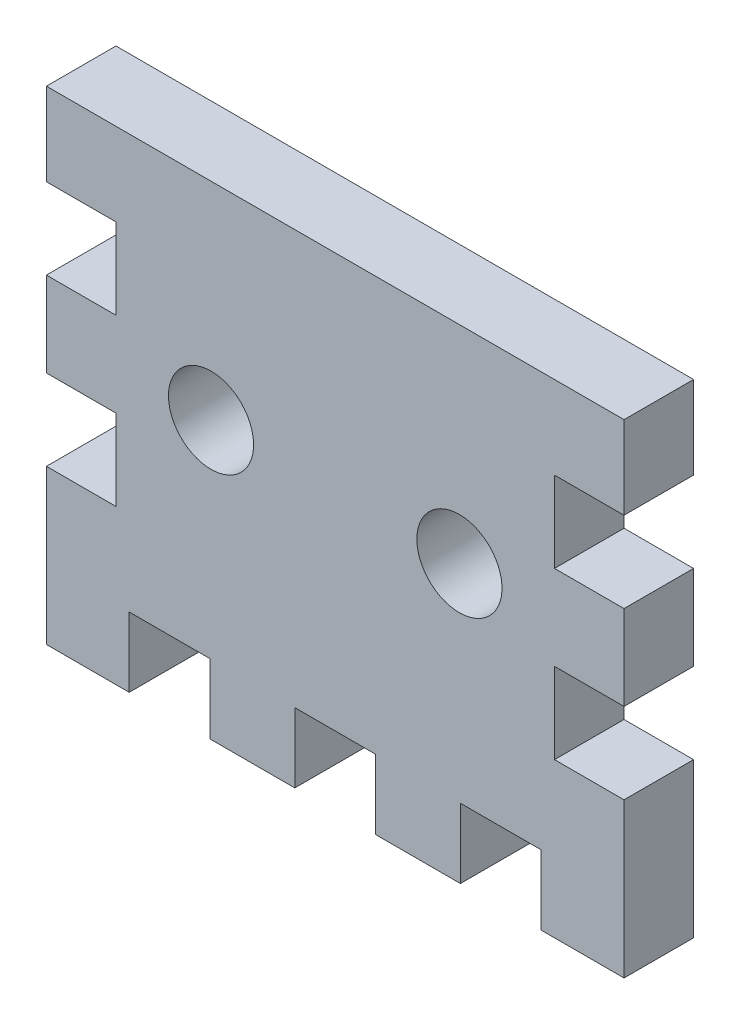
ISO-10303-21;
HEADER;
FILE_DESCRIPTION(('STEP AP214'),'2;1');
FILE_NAME('part.step','',(''),(''),'','','');
FILE_SCHEMA(('AUTOMOTIVE_DESIGN { 1 0 10303 214 1 1 1 1 }'));
ENDSEC;
DATA;
#1=APPLICATION_CONTEXT('core data for automotive mechanical design processes');
#2=APPLICATION_PROTOCOL_DEFINITION('international standard','automotive_design',2000,#1);
#3=PRODUCT_CONTEXT('',#1,'mechanical');
#4=PRODUCT('Part','Part','',(#3));
#5=PRODUCT_RELATED_PRODUCT_CATEGORY('part','',(#4));
#6=PRODUCT_DEFINITION_FORMATION('','',#4);
#7=PRODUCT_DEFINITION_CONTEXT('part definition',#1,'design');
#8=PRODUCT_DEFINITION('design','',#6,#7);
#9=PRODUCT_DEFINITION_SHAPE('','',#8);
#10=(LENGTH_UNIT() NAMED_UNIT(*) SI_UNIT(.MILLI.,.METRE.));
#11=(NAMED_UNIT(*) PLANE_ANGLE_UNIT() SI_UNIT($,.RADIAN.));
#12=(NAMED_UNIT(*) SI_UNIT($,.STERADIAN.) SOLID_ANGLE_UNIT());
#13=UNCERTAINTY_MEASURE_WITH_UNIT(LENGTH_MEASURE(1.E-05),#10,'distance_accuracy_value','');
#14=(GEOMETRIC_REPRESENTATION_CONTEXT(3) GLOBAL_UNCERTAINTY_ASSIGNED_CONTEXT((#13)) GLOBAL_UNIT_ASSIGNED_CONTEXT((#10,
#11,#12)) REPRESENTATION_CONTEXT('',''));
#15=CARTESIAN_POINT('',(0.,0.,0.));
#16=DIRECTION('',(0.,0.,1.));
#17=DIRECTION('',(1.,0.,0.));
#18=AXIS2_PLACEMENT_3D('',#15,#16,#17);
#19=CARTESIAN_POINT('',(27.94,-5.33400000000002,-5.334));
#20=DIRECTION('',(1.,0.,0.));
#21=DIRECTION('',(0.,0.,-1.));
#22=AXIS2_PLACEMENT_3D('',#19,#20,#21);
#23=PLANE('',#22);
#24=DIRECTION('',(0.,1.,0.));
#25=VECTOR('',#24,1.);
#26=CARTESIAN_POINT('',(27.94,-5.33400000000002,0.));
#27=LINE('',#26,#25);
#28=CARTESIAN_POINT('',(27.9400000000001,12.7,0.));
#29=VERTEX_POINT('',#28);
#30=CARTESIAN_POINT('',(27.9400000000001,19.2024,0.));
#31=VERTEX_POINT('',#30);
#32=EDGE_CURVE('E260',#29,#31,#27,.T.);
#33=ORIENTED_EDGE('',*,*,#32,.T.);
#34=DIRECTION('',(0.,0.,-1.));
#35=VECTOR('',#34,1.);
#36=CARTESIAN_POINT('',(27.9400000000001,19.2024,0.));
#37=LINE('',#36,#35);
#38=CARTESIAN_POINT('',(27.9400000000001,19.2024,-5.334));
#39=VERTEX_POINT('',#38);
#40=EDGE_CURVE('E244',#31,#39,#37,.T.);
#41=ORIENTED_EDGE('',*,*,#40,.T.);
#42=DIRECTION('',(0.,1.,0.));
#43=VECTOR('',#42,1.);
#44=CARTESIAN_POINT('',(27.94,-5.33400000000002,-5.334));
#45=LINE('',#44,#43);
#46=CARTESIAN_POINT('',(27.9400000000001,12.7,-5.334));
#47=VERTEX_POINT('',#46);
#48=EDGE_CURVE('E290',#47,#39,#45,.T.);
#49=ORIENTED_EDGE('',*,*,#48,.F.);
#50=DIRECTION('',(0.,0.,-1.));
#51=VECTOR('',#50,1.);
#52=CARTESIAN_POINT('',(27.9400000000001,12.7,0.));
#53=LINE('',#52,#51);
#54=EDGE_CURVE('E266',#29,#47,#53,.T.);
#55=ORIENTED_EDGE('',*,*,#54,.F.);
#56=EDGE_LOOP('',(#33,#41,#49,#55));
#57=FACE_BOUND('',#56,.T.);
#58=ADVANCED_FACE('F34',(#57),#23,.F.);
#59=CARTESIAN_POINT('',(72.2376,-5.334,-5.334));
#60=DIRECTION('',(1.,0.,0.));
#61=DIRECTION('',(0.,0.,-1.));
#62=AXIS2_PLACEMENT_3D('',#59,#60,#61);
#63=PLANE('',#62);
#64=DIRECTION('',(0.,0.,-1.));
#65=VECTOR('',#64,1.);
#66=CARTESIAN_POINT('',(72.2376,25.4,0.));
#67=LINE('',#66,#65);
#68=CARTESIAN_POINT('',(72.2376,25.4,0.));
#69=VERTEX_POINT('',#68);
#70=CARTESIAN_POINT('',(72.2376,25.4,-5.334));
#71=VERTEX_POINT('',#70);
#72=EDGE_CURVE('E441',#69,#71,#67,.T.);
#73=ORIENTED_EDGE('',*,*,#72,.T.);
#74=DIRECTION('',(0.,1.,0.));
#75=VECTOR('',#74,1.);
#76=CARTESIAN_POINT('',(72.2376,-5.334,-5.334));
#77=LINE('',#76,#75);
#78=CARTESIAN_POINT('',(72.2376,31.75,-5.334));
#79=VERTEX_POINT('',#78);
#80=EDGE_CURVE('E310',#71,#79,#77,.T.);
#81=ORIENTED_EDGE('',*,*,#80,.T.);
#82=DIRECTION('',(0.,0.,1.));
#83=VECTOR('',#82,1.);
#84=CARTESIAN_POINT('',(72.2376,31.75,-5.334));
#85=LINE('',#84,#83);
#86=CARTESIAN_POINT('',(72.2376,31.75,0.));
#87=VERTEX_POINT('',#86);
#88=EDGE_CURVE('E277',#79,#87,#85,.T.);
#89=ORIENTED_EDGE('',*,*,#88,.T.);
#90=DIRECTION('',(0.,1.,0.));
#91=VECTOR('',#90,1.);
#92=CARTESIAN_POINT('',(72.2376,-5.334,0.));
#93=LINE('',#92,#91);
#94=EDGE_CURVE('E524',#69,#87,#93,.T.);
#95=ORIENTED_EDGE('',*,*,#94,.F.);
#96=EDGE_LOOP('',(#73,#81,#89,#95));
#97=FACE_BOUND('',#96,.T.);
#98=ADVANCED_FACE('F575',(#97),#63,.T.);
#99=CARTESIAN_POINT('',(27.94,-5.33400000000002,0.));
#100=VERTEX_POINT('',#99);
#101=CARTESIAN_POINT('',(27.94,6.50239999999998,0.));
#102=VERTEX_POINT('',#101);
#103=EDGE_CURVE('E267',#100,#102,#27,.T.);
#104=ORIENTED_EDGE('',*,*,#103,.T.);
#105=DIRECTION('',(0.,0.,-1.));
#106=VECTOR('',#105,1.);
#107=CARTESIAN_POINT('',(27.94,6.50239999999998,0.));
#108=LINE('',#107,#106);
#109=CARTESIAN_POINT('',(27.94,6.50239999999998,-5.334));
#110=VERTEX_POINT('',#109);
#111=EDGE_CURVE('E424',#102,#110,#108,.T.);
#112=ORIENTED_EDGE('',*,*,#111,.T.);
#113=CARTESIAN_POINT('',(27.94,-5.33400000000002,-5.334));
#114=VERTEX_POINT('',#113);
#115=EDGE_CURVE('E284',#114,#110,#45,.T.);
#116=ORIENTED_EDGE('',*,*,#115,.F.);
#117=DIRECTION('',(0.,0.,1.));
#118=VECTOR('',#117,1.);
#119=CARTESIAN_POINT('',(27.94,-5.33400000000002,-5.334));
#120=LINE('',#119,#118);
#121=EDGE_CURVE('E11',#114,#100,#120,.T.);
#122=ORIENTED_EDGE('',*,*,#121,.T.);
#123=EDGE_LOOP('',(#104,#112,#116,#122));
#124=FACE_BOUND('',#123,.T.);
#125=ADVANCED_FACE('F518',(#124),#23,.F.);
#126=DIRECTION('',(0.,0.,-1.));
#127=VECTOR('',#126,1.);
#128=CARTESIAN_POINT('',(72.2376,19.2024,0.));
#129=LINE('',#128,#127);
#130=CARTESIAN_POINT('',(72.2376,19.2024,0.));
#131=VERTEX_POINT('',#130);
#132=CARTESIAN_POINT('',(72.2376,19.2024,-5.334));
#133=VERTEX_POINT('',#132);
#134=EDGE_CURVE('E448',#131,#133,#129,.T.);
#135=ORIENTED_EDGE('',*,*,#134,.F.);
#136=CARTESIAN_POINT('',(72.2376,12.7,0.));
#137=VERTEX_POINT('',#136);
#138=EDGE_CURVE('E526',#137,#131,#93,.T.);
#139=ORIENTED_EDGE('',*,*,#138,.F.);
#140=DIRECTION('',(0.,0.,-1.));
#141=VECTOR('',#140,1.);
#142=CARTESIAN_POINT('',(72.2376,12.7,0.));
#143=LINE('',#142,#141);
#144=CARTESIAN_POINT('',(72.2376,12.7,-5.334));
#145=VERTEX_POINT('',#144);
#146=EDGE_CURVE('E390',#137,#145,#143,.T.);
#147=ORIENTED_EDGE('',*,*,#146,.T.);
#148=EDGE_CURVE('E308',#145,#133,#77,.T.);
#149=ORIENTED_EDGE('',*,*,#148,.T.);
#150=EDGE_LOOP('',(#135,#139,#147,#149));
#151=FACE_BOUND('',#150,.T.);
#152=ADVANCED_FACE('F562',(#151),#63,.T.);
#153=CARTESIAN_POINT('',(27.94,-5.33400000000002,-5.334));
#154=DIRECTION('',(0.,-1.,0.));
#155=DIRECTION('',(0.,0.,-1.));
#156=AXIS2_PLACEMENT_3D('',#153,#154,#155);
#157=PLANE('',#156);
#158=DIRECTION('',(0.,0.,1.));
#159=VECTOR('',#158,1.);
#160=CARTESIAN_POINT('',(40.4876,-5.33399999999999,-5.334));
#161=LINE('',#160,#159);
#162=CARTESIAN_POINT('',(40.4876,-5.33399999999999,-5.334));
#163=VERTEX_POINT('',#162);
#164=CARTESIAN_POINT('',(40.4876,-5.33399999999999,0.));
#165=VERTEX_POINT('',#164);
#166=EDGE_CURVE('E364',#163,#165,#161,.T.);
#167=ORIENTED_EDGE('',*,*,#166,.F.);
#168=DIRECTION('',(1.,0.,0.));
#169=VECTOR('',#168,1.);
#170=CARTESIAN_POINT('',(27.94,-5.33400000000002,-5.334));
#171=LINE('',#170,#169);
#172=CARTESIAN_POINT('',(46.99,-5.33400000000002,-5.334));
#173=VERTEX_POINT('',#172);
#174=EDGE_CURVE('E315',#163,#173,#171,.T.);
#175=ORIENTED_EDGE('',*,*,#174,.T.);
#176=DIRECTION('',(0.,0.,1.));
#177=VECTOR('',#176,1.);
#178=CARTESIAN_POINT('',(46.99,-5.33400000000002,-5.334));
#179=LINE('',#178,#177);
#180=CARTESIAN_POINT('',(46.99,-5.33400000000002,0.));
#181=VERTEX_POINT('',#180);
#182=EDGE_CURVE('E351',#173,#181,#179,.T.);
#183=ORIENTED_EDGE('',*,*,#182,.T.);
#184=DIRECTION('',(1.,0.,0.));
#185=VECTOR('',#184,1.);
#186=CARTESIAN_POINT('',(27.94,-5.33400000000002,0.));
#187=LINE('',#186,#185);
#188=EDGE_CURVE('E525',#165,#181,#187,.T.);
#189=ORIENTED_EDGE('',*,*,#188,.F.);
#190=EDGE_LOOP('',(#167,#175,#183,#189));
#191=FACE_BOUND('',#190,.T.);
#192=ADVANCED_FACE('F585',(#191),#157,.T.);
#193=DIRECTION('',(0.,0.,1.));
#194=VECTOR('',#193,1.);
#195=CARTESIAN_POINT('',(53.1876,-5.334,-5.334));
#196=LINE('',#195,#194);
#197=CARTESIAN_POINT('',(53.1876,-5.334,-5.334));
#198=VERTEX_POINT('',#197);
#199=CARTESIAN_POINT('',(53.1876,-5.334,0.));
#200=VERTEX_POINT('',#199);
#201=EDGE_CURVE('E337',#198,#200,#196,.T.);
#202=ORIENTED_EDGE('',*,*,#201,.F.);
#203=CARTESIAN_POINT('',(59.69,-5.334,-5.334));
#204=VERTEX_POINT('',#203);
#205=EDGE_CURVE('E544',#198,#204,#171,.T.);
#206=ORIENTED_EDGE('',*,*,#205,.T.);
#207=DIRECTION('',(0.,0.,1.));
#208=VECTOR('',#207,1.);
#209=CARTESIAN_POINT('',(59.69,-5.334,-5.334));
#210=LINE('',#209,#208);
#211=CARTESIAN_POINT('',(59.69,-5.334,0.));
#212=VERTEX_POINT('',#211);
#213=EDGE_CURVE('E322',#204,#212,#210,.T.);
#214=ORIENTED_EDGE('',*,*,#213,.T.);
#215=EDGE_CURVE('E528',#200,#212,#187,.T.);
#216=ORIENTED_EDGE('',*,*,#215,.F.);
#217=EDGE_LOOP('',(#202,#206,#214,#216));
#218=FACE_BOUND('',#217,.T.);
#219=ADVANCED_FACE('F542',(#218),#157,.T.);
#220=DIRECTION('',(0.,0.,1.));
#221=VECTOR('',#220,1.);
#222=CARTESIAN_POINT('',(65.8876,-5.33400000000002,-5.334));
#223=LINE('',#222,#221);
#224=CARTESIAN_POINT('',(65.8876,-5.33400000000002,-5.334));
#225=VERTEX_POINT('',#224);
#226=CARTESIAN_POINT('',(65.8876,-5.33400000000002,0.));
#227=VERTEX_POINT('',#226);
#228=EDGE_CURVE('E325',#225,#227,#223,.T.);
#229=ORIENTED_EDGE('',*,*,#228,.F.);
#230=CARTESIAN_POINT('',(72.2376,-5.334,-5.334));
#231=VERTEX_POINT('',#230);
#232=EDGE_CURVE('E271',#225,#231,#171,.T.);
#233=ORIENTED_EDGE('',*,*,#232,.T.);
#234=DIRECTION('',(0.,0.,1.));
#235=VECTOR('',#234,1.);
#236=CARTESIAN_POINT('',(72.2376,-5.334,-5.334));
#237=LINE('',#236,#235);
#238=CARTESIAN_POINT('',(72.2376,-5.334,0.));
#239=VERTEX_POINT('',#238);
#240=EDGE_CURVE('E38',#231,#239,#237,.T.);
#241=ORIENTED_EDGE('',*,*,#240,.T.);
#242=EDGE_CURVE('E327',#227,#239,#187,.T.);
#243=ORIENTED_EDGE('',*,*,#242,.F.);
#244=EDGE_LOOP('',(#229,#233,#241,#243));
#245=FACE_BOUND('',#244,.T.);
#246=ADVANCED_FACE('F547',(#245),#157,.T.);
#247=DIRECTION('',(0.,0.,1.));
#248=VECTOR('',#247,1.);
#249=CARTESIAN_POINT('',(34.29,-5.334,-5.334));
#250=LINE('',#249,#248);
#251=CARTESIAN_POINT('',(34.29,-5.334,-5.334));
#252=VERTEX_POINT('',#251);
#253=CARTESIAN_POINT('',(34.29,-5.334,0.));
#254=VERTEX_POINT('',#253);
#255=EDGE_CURVE('E378',#252,#254,#250,.T.);
#256=ORIENTED_EDGE('',*,*,#255,.T.);
#257=EDGE_CURVE('E522',#100,#254,#187,.T.);
#258=ORIENTED_EDGE('',*,*,#257,.F.);
#259=ORIENTED_EDGE('',*,*,#121,.F.);
#260=EDGE_CURVE('E312',#114,#252,#171,.T.);
#261=ORIENTED_EDGE('',*,*,#260,.T.);
#262=EDGE_LOOP('',(#256,#258,#259,#261));
#263=FACE_BOUND('',#262,.T.);
#264=ADVANCED_FACE('F36',(#263),#157,.T.);
#265=CARTESIAN_POINT('',(27.94,25.4,-5.334));
#266=VERTEX_POINT('',#265);
#267=CARTESIAN_POINT('',(27.94,31.75,-5.334));
#268=VERTEX_POINT('',#267);
#269=EDGE_CURVE('E292',#266,#268,#45,.T.);
#270=ORIENTED_EDGE('',*,*,#269,.F.);
#271=DIRECTION('',(0.,0.,-1.));
#272=VECTOR('',#271,1.);
#273=CARTESIAN_POINT('',(27.94,25.4,0.));
#274=LINE('',#273,#272);
#275=CARTESIAN_POINT('',(27.94,25.4,0.));
#276=VERTEX_POINT('',#275);
#277=EDGE_CURVE('E254',#276,#266,#274,.T.);
#278=ORIENTED_EDGE('',*,*,#277,.F.);
#279=CARTESIAN_POINT('',(27.94,31.75,0.));
#280=VERTEX_POINT('',#279);
#281=EDGE_CURVE('E268',#276,#280,#27,.T.);
#282=ORIENTED_EDGE('',*,*,#281,.T.);
#283=DIRECTION('',(0.,0.,1.));
#284=VECTOR('',#283,1.);
#285=CARTESIAN_POINT('',(27.94,31.75,-5.334));
#286=LINE('',#285,#284);
#287=EDGE_CURVE('E43',#268,#280,#286,.T.);
#288=ORIENTED_EDGE('',*,*,#287,.F.);
#289=EDGE_LOOP('',(#270,#278,#282,#288));
#290=FACE_BOUND('',#289,.T.);
#291=ADVANCED_FACE('F582',(#290),#23,.F.);
#292=CARTESIAN_POINT('',(27.94,31.75,-5.334));
#293=DIRECTION('',(0.,-1.,0.));
#294=DIRECTION('',(0.,0.,-1.));
#295=AXIS2_PLACEMENT_3D('',#292,#293,#294);
#296=PLANE('',#295);
#297=DIRECTION('',(1.,0.,0.));
#298=VECTOR('',#297,1.);
#299=CARTESIAN_POINT('',(27.94,31.75,0.));
#300=LINE('',#299,#298);
#301=EDGE_CURVE('E272',#280,#87,#300,.T.);
#302=ORIENTED_EDGE('',*,*,#301,.T.);
#303=ORIENTED_EDGE('',*,*,#88,.F.);
#304=DIRECTION('',(1.,0.,0.));
#305=VECTOR('',#304,1.);
#306=CARTESIAN_POINT('',(27.94,31.75,-5.334));
#307=LINE('',#306,#305);
#308=EDGE_CURVE('E299',#268,#79,#307,.T.);
#309=ORIENTED_EDGE('',*,*,#308,.F.);
#310=ORIENTED_EDGE('',*,*,#287,.T.);
#311=EDGE_LOOP('',(#302,#303,#309,#310));
#312=FACE_BOUND('',#311,.T.);
#313=ADVANCED_FACE('F587',(#312),#296,.F.);
#314=DIRECTION('',(0.,0.,-1.));
#315=VECTOR('',#314,1.);
#316=CARTESIAN_POINT('',(72.2376,6.50239999999999,0.));
#317=LINE('',#316,#315);
#318=CARTESIAN_POINT('',(72.2376,6.50239999999999,0.));
#319=VERTEX_POINT('',#318);
#320=CARTESIAN_POINT('',(72.2376,6.50239999999999,-5.334));
#321=VERTEX_POINT('',#320);
#322=EDGE_CURVE('E398',#319,#321,#317,.T.);
#323=ORIENTED_EDGE('',*,*,#322,.F.);
#324=EDGE_CURVE('E527',#239,#319,#93,.T.);
#325=ORIENTED_EDGE('',*,*,#324,.F.);
#326=ORIENTED_EDGE('',*,*,#240,.F.);
#327=EDGE_CURVE('E304',#231,#321,#77,.T.);
#328=ORIENTED_EDGE('',*,*,#327,.T.);
#329=EDGE_LOOP('',(#323,#325,#326,#328));
#330=FACE_BOUND('',#329,.T.);
#331=ADVANCED_FACE('F502',(#330),#63,.T.);
#332=CARTESIAN_POINT('',(0.,0.,-5.334));
#333=DIRECTION('',(0.,0.,1.));
#334=DIRECTION('',(1.,0.,0.));
#335=AXIS2_PLACEMENT_3D('',#332,#333,#334);
#336=PLANE('',#335);
#337=CARTESIAN_POINT('',(59.6138,15.875,-5.334));
#338=DIRECTION('',(0.,0.,-1.));
#339=DIRECTION('',(-1.,0.,0.));
#340=AXIS2_PLACEMENT_3D('',#337,#338,#339);
#341=CIRCLE('',#340,3.26389999999999);
#342=CARTESIAN_POINT('',(56.3499,15.875,-5.334));
#343=VERTEX_POINT('',#342);
#344=EDGE_CURVE('E493',#343,#343,#341,.T.);
#345=ORIENTED_EDGE('',*,*,#344,.F.);
#346=EDGE_LOOP('',(#345));
#347=FACE_BOUND('',#346,.T.);
#348=CARTESIAN_POINT('',(40.5638,15.875,-5.334));
#349=DIRECTION('',(0.,0.,-1.));
#350=DIRECTION('',(-1.,0.,0.));
#351=AXIS2_PLACEMENT_3D('',#348,#349,#350);
#352=CIRCLE('',#351,3.26389999999999);
#353=CARTESIAN_POINT('',(37.2999,15.875,-5.334));
#354=VERTEX_POINT('',#353);
#355=EDGE_CURVE('E487',#354,#354,#352,.T.);
#356=ORIENTED_EDGE('',*,*,#355,.F.);
#357=EDGE_LOOP('',(#356));
#358=FACE_BOUND('',#357,.T.);
#359=ORIENTED_EDGE('',*,*,#48,.T.);
#360=DIRECTION('',(-1.,0.,0.));
#361=VECTOR('',#360,1.);
#362=CARTESIAN_POINT('',(27.9400000000001,19.2024,-5.334));
#363=LINE('',#362,#361);
#364=CARTESIAN_POINT('',(33.2740000000001,19.2024,-5.334));
#365=VERTEX_POINT('',#364);
#366=EDGE_CURVE('E249',#365,#39,#363,.T.);
#367=ORIENTED_EDGE('',*,*,#366,.F.);
#368=DIRECTION('',(0.,-1.,0.));
#369=VECTOR('',#368,1.);
#370=CARTESIAN_POINT('',(33.2740000000001,19.2024,-5.334));
#371=LINE('',#370,#369);
#372=CARTESIAN_POINT('',(33.2740000000001,25.4,-5.334));
#373=VERTEX_POINT('',#372);
#374=EDGE_CURVE('E263',#373,#365,#371,.T.);
#375=ORIENTED_EDGE('',*,*,#374,.F.);
#376=DIRECTION('',(1.,0.,0.));
#377=VECTOR('',#376,1.);
#378=CARTESIAN_POINT('',(27.94,25.4,-5.334));
#379=LINE('',#378,#377);
#380=EDGE_CURVE('E478',#266,#373,#379,.T.);
#381=ORIENTED_EDGE('',*,*,#380,.F.);
#382=ORIENTED_EDGE('',*,*,#269,.T.);
#383=ORIENTED_EDGE('',*,*,#308,.T.);
#384=ORIENTED_EDGE('',*,*,#80,.F.);
#385=DIRECTION('',(1.,0.,0.));
#386=VECTOR('',#385,1.);
#387=CARTESIAN_POINT('',(72.2376,25.4,-5.334));
#388=LINE('',#387,#386);
#389=CARTESIAN_POINT('',(66.9036,25.4,-5.334));
#390=VERTEX_POINT('',#389);
#391=EDGE_CURVE('E457',#390,#71,#388,.T.);
#392=ORIENTED_EDGE('',*,*,#391,.F.);
#393=DIRECTION('',(0.,1.,0.));
#394=VECTOR('',#393,1.);
#395=CARTESIAN_POINT('',(66.9036,19.2024,-5.334));
#396=LINE('',#395,#394);
#397=CARTESIAN_POINT('',(66.9036,19.2024,-5.334));
#398=VERTEX_POINT('',#397);
#399=EDGE_CURVE('E460',#398,#390,#396,.T.);
#400=ORIENTED_EDGE('',*,*,#399,.F.);
#401=DIRECTION('',(-1.,0.,0.));
#402=VECTOR('',#401,1.);
#403=CARTESIAN_POINT('',(72.2376,19.2024,-5.334));
#404=LINE('',#403,#402);
#405=EDGE_CURVE('E463',#133,#398,#404,.T.);
#406=ORIENTED_EDGE('',*,*,#405,.F.);
#407=ORIENTED_EDGE('',*,*,#148,.F.);
#408=DIRECTION('',(1.,0.,0.));
#409=VECTOR('',#408,1.);
#410=CARTESIAN_POINT('',(72.2376,12.7,-5.334));
#411=LINE('',#410,#409);
#412=CARTESIAN_POINT('',(66.9036,12.7,-5.334));
#413=VERTEX_POINT('',#412);
#414=EDGE_CURVE('E407',#413,#145,#411,.T.);
#415=ORIENTED_EDGE('',*,*,#414,.F.);
#416=DIRECTION('',(0.,1.,0.));
#417=VECTOR('',#416,1.);
#418=CARTESIAN_POINT('',(66.9036,6.50240000000001,-5.334));
#419=LINE('',#418,#417);
#420=CARTESIAN_POINT('',(66.9036,6.50240000000001,-5.334));
#421=VERTEX_POINT('',#420);
#422=EDGE_CURVE('E410',#421,#413,#419,.T.);
#423=ORIENTED_EDGE('',*,*,#422,.F.);
#424=DIRECTION('',(-1.,0.,0.));
#425=VECTOR('',#424,1.);
#426=CARTESIAN_POINT('',(72.2376,6.50239999999999,-5.334));
#427=LINE('',#426,#425);
#428=EDGE_CURVE('E413',#321,#421,#427,.T.);
#429=ORIENTED_EDGE('',*,*,#428,.F.);
#430=ORIENTED_EDGE('',*,*,#327,.F.);
#431=ORIENTED_EDGE('',*,*,#232,.F.);
#432=DIRECTION('',(0.,1.,0.));
#433=VECTOR('',#432,1.);
#434=CARTESIAN_POINT('',(65.8876,-5.33400000000002,-5.334));
#435=LINE('',#434,#433);
#436=CARTESIAN_POINT('',(65.8876,0.,-5.334));
#437=VERTEX_POINT('',#436);
#438=EDGE_CURVE('E331',#225,#437,#435,.T.);
#439=ORIENTED_EDGE('',*,*,#438,.T.);
#440=DIRECTION('',(-1.,0.,0.));
#441=VECTOR('',#440,1.);
#442=CARTESIAN_POINT('',(65.8876,0.,-5.334));
#443=LINE('',#442,#441);
#444=CARTESIAN_POINT('',(59.69,0.,-5.334));
#445=VERTEX_POINT('',#444);
#446=EDGE_CURVE('E340',#437,#445,#443,.T.);
#447=ORIENTED_EDGE('',*,*,#446,.T.);
#448=DIRECTION('',(0.,-1.,0.));
#449=VECTOR('',#448,1.);
#450=CARTESIAN_POINT('',(59.69,-5.334,-5.334));
#451=LINE('',#450,#449);
#452=EDGE_CURVE('E320',#445,#204,#451,.T.);
#453=ORIENTED_EDGE('',*,*,#452,.T.);
#454=ORIENTED_EDGE('',*,*,#205,.F.);
#455=DIRECTION('',(0.,1.,0.));
#456=VECTOR('',#455,1.);
#457=CARTESIAN_POINT('',(53.1876,-5.334,-5.334));
#458=LINE('',#457,#456);
#459=CARTESIAN_POINT('',(53.1876,0.,-5.334));
#460=VERTEX_POINT('',#459);
#461=EDGE_CURVE('E358',#198,#460,#458,.T.);
#462=ORIENTED_EDGE('',*,*,#461,.T.);
#463=DIRECTION('',(-1.,0.,0.));
#464=VECTOR('',#463,1.);
#465=CARTESIAN_POINT('',(53.1876,0.,-5.334));
#466=LINE('',#465,#464);
#467=CARTESIAN_POINT('',(46.99,0.,-5.334));
#468=VERTEX_POINT('',#467);
#469=EDGE_CURVE('E367',#460,#468,#466,.T.);
#470=ORIENTED_EDGE('',*,*,#469,.T.);
#471=DIRECTION('',(0.,-1.,0.));
#472=VECTOR('',#471,1.);
#473=CARTESIAN_POINT('',(46.99,-5.33400000000002,-5.334));
#474=LINE('',#473,#472);
#475=EDGE_CURVE('E349',#468,#173,#474,.T.);
#476=ORIENTED_EDGE('',*,*,#475,.T.);
#477=ORIENTED_EDGE('',*,*,#174,.F.);
#478=DIRECTION('',(0.,1.,0.));
#479=VECTOR('',#478,1.);
#480=CARTESIAN_POINT('',(40.4876,-5.33399999999999,-5.334));
#481=LINE('',#480,#479);
#482=CARTESIAN_POINT('',(40.4876000000001,0.,-5.334));
#483=VERTEX_POINT('',#482);
#484=EDGE_CURVE('E384',#163,#483,#481,.T.);
#485=ORIENTED_EDGE('',*,*,#484,.T.);
#486=DIRECTION('',(-1.,0.,0.));
#487=VECTOR('',#486,1.);
#488=CARTESIAN_POINT('',(40.4876000000001,0.,-5.334));
#489=LINE('',#488,#487);
#490=CARTESIAN_POINT('',(34.29,0.,-5.334));
#491=VERTEX_POINT('',#490);
#492=EDGE_CURVE('E393',#483,#491,#489,.T.);
#493=ORIENTED_EDGE('',*,*,#492,.T.);
#494=DIRECTION('',(0.,-1.,0.));
#495=VECTOR('',#494,1.);
#496=CARTESIAN_POINT('',(34.29,-5.334,-5.334));
#497=LINE('',#496,#495);
#498=EDGE_CURVE('E376',#491,#252,#497,.T.);
#499=ORIENTED_EDGE('',*,*,#498,.T.);
#500=ORIENTED_EDGE('',*,*,#260,.F.);
#501=ORIENTED_EDGE('',*,*,#115,.T.);
#502=DIRECTION('',(-1.,0.,0.));
#503=VECTOR('',#502,1.);
#504=CARTESIAN_POINT('',(27.94,6.50239999999998,-5.334));
#505=LINE('',#504,#503);
#506=CARTESIAN_POINT('',(33.2740000000001,6.50240000000001,-5.334));
#507=VERTEX_POINT('',#506);
#508=EDGE_CURVE('E439',#507,#110,#505,.T.);
#509=ORIENTED_EDGE('',*,*,#508,.F.);
#510=DIRECTION('',(0.,-1.,0.));
#511=VECTOR('',#510,1.);
#512=CARTESIAN_POINT('',(33.2740000000001,6.50240000000001,-5.334));
#513=LINE('',#512,#511);
#514=CARTESIAN_POINT('',(33.2740000000001,12.7,-5.334));
#515=VERTEX_POINT('',#514);
#516=EDGE_CURVE('E432',#515,#507,#513,.T.);
#517=ORIENTED_EDGE('',*,*,#516,.F.);
#518=DIRECTION('',(1.,0.,0.));
#519=VECTOR('',#518,1.);
#520=CARTESIAN_POINT('',(27.9400000000001,12.7,-5.334));
#521=LINE('',#520,#519);
#522=EDGE_CURVE('E436',#47,#515,#521,.T.);
#523=ORIENTED_EDGE('',*,*,#522,.F.);
#524=EDGE_LOOP('',(#359,#367,#375,#381,#382,#383,#384,#392,#400,#406,#407,#415,#423,#429,#430,
#431,#439,#447,#453,#454,#462,#470,#476,#477,#485,#493,#499,#500,#501,#509,#517,#523));
#525=FACE_BOUND('',#524,.T.);
#526=ADVANCED_FACE('F499',(#347,#358,#525),#336,.F.);
#527=CARTESIAN_POINT('',(0.,0.,0.));
#528=DIRECTION('',(0.,0.,1.));
#529=DIRECTION('',(1.,0.,0.));
#530=AXIS2_PLACEMENT_3D('',#527,#528,#529);
#531=PLANE('',#530);
#532=CARTESIAN_POINT('',(59.6138,15.875,0.));
#533=DIRECTION('',(0.,0.,-1.));
#534=DIRECTION('',(-1.,0.,0.));
#535=AXIS2_PLACEMENT_3D('',#532,#533,#534);
#536=CIRCLE('',#535,3.26389999999999);
#537=CARTESIAN_POINT('',(56.3499,15.875,0.));
#538=VERTEX_POINT('',#537);
#539=EDGE_CURVE('E490',#538,#538,#536,.T.);
#540=ORIENTED_EDGE('',*,*,#539,.T.);
#541=EDGE_LOOP('',(#540));
#542=FACE_BOUND('',#541,.T.);
#543=CARTESIAN_POINT('',(40.5638,15.875,0.));
#544=DIRECTION('',(0.,0.,-1.));
#545=DIRECTION('',(-1.,0.,0.));
#546=AXIS2_PLACEMENT_3D('',#543,#544,#545);
#547=CIRCLE('',#546,3.2639);
#548=CARTESIAN_POINT('',(37.2999,15.875,0.));
#549=VERTEX_POINT('',#548);
#550=EDGE_CURVE('E482',#549,#549,#547,.T.);
#551=ORIENTED_EDGE('',*,*,#550,.T.);
#552=EDGE_LOOP('',(#551));
#553=FACE_BOUND('',#552,.T.);
#554=DIRECTION('',(-1.,0.,0.));
#555=VECTOR('',#554,1.);
#556=CARTESIAN_POINT('',(27.9400000000001,19.2024,0.));
#557=LINE('',#556,#555);
#558=CARTESIAN_POINT('',(33.2740000000001,19.2024,0.));
#559=VERTEX_POINT('',#558);
#560=EDGE_CURVE('E247',#559,#31,#557,.T.);
#561=ORIENTED_EDGE('',*,*,#560,.T.);
#562=ORIENTED_EDGE('',*,*,#32,.F.);
#563=DIRECTION('',(1.,0.,0.));
#564=VECTOR('',#563,1.);
#565=CARTESIAN_POINT('',(27.9400000000001,12.7,0.));
#566=LINE('',#565,#564);
#567=CARTESIAN_POINT('',(33.2740000000001,12.7,0.));
#568=VERTEX_POINT('',#567);
#569=EDGE_CURVE('E444',#29,#568,#566,.T.);
#570=ORIENTED_EDGE('',*,*,#569,.T.);
#571=DIRECTION('',(0.,-1.,0.));
#572=VECTOR('',#571,1.);
#573=CARTESIAN_POINT('',(33.2740000000001,6.50240000000001,0.));
#574=LINE('',#573,#572);
#575=CARTESIAN_POINT('',(33.2740000000001,6.50240000000001,0.));
#576=VERTEX_POINT('',#575);
#577=EDGE_CURVE('E427',#568,#576,#574,.T.);
#578=ORIENTED_EDGE('',*,*,#577,.T.);
#579=DIRECTION('',(-1.,0.,0.));
#580=VECTOR('',#579,1.);
#581=CARTESIAN_POINT('',(27.94,6.50239999999998,0.));
#582=LINE('',#581,#580);
#583=EDGE_CURVE('E435',#576,#102,#582,.T.);
#584=ORIENTED_EDGE('',*,*,#583,.T.);
#585=ORIENTED_EDGE('',*,*,#103,.F.);
#586=ORIENTED_EDGE('',*,*,#257,.T.);
#587=DIRECTION('',(0.,-1.,0.));
#588=VECTOR('',#587,1.);
#589=CARTESIAN_POINT('',(34.29,-5.334,0.));
#590=LINE('',#589,#588);
#591=CARTESIAN_POINT('',(34.29,0.,0.));
#592=VERTEX_POINT('',#591);
#593=EDGE_CURVE('E382',#592,#254,#590,.T.);
#594=ORIENTED_EDGE('',*,*,#593,.F.);
#595=DIRECTION('',(-1.,0.,0.));
#596=VECTOR('',#595,1.);
#597=CARTESIAN_POINT('',(40.4876000000001,0.,0.));
#598=LINE('',#597,#596);
#599=CARTESIAN_POINT('',(40.4876000000001,0.,0.));
#600=VERTEX_POINT('',#599);
#601=EDGE_CURVE('E385',#600,#592,#598,.T.);
#602=ORIENTED_EDGE('',*,*,#601,.F.);
#603=DIRECTION('',(0.,1.,0.));
#604=VECTOR('',#603,1.);
#605=CARTESIAN_POINT('',(40.4876,-5.33399999999999,0.));
#606=LINE('',#605,#604);
#607=EDGE_CURVE('E388',#165,#600,#606,.T.);
#608=ORIENTED_EDGE('',*,*,#607,.F.);
#609=ORIENTED_EDGE('',*,*,#188,.T.);
#610=DIRECTION('',(0.,-1.,0.));
#611=VECTOR('',#610,1.);
#612=CARTESIAN_POINT('',(46.99,-5.33400000000002,0.));
#613=LINE('',#612,#611);
#614=CARTESIAN_POINT('',(46.99,0.,0.));
#615=VERTEX_POINT('',#614);
#616=EDGE_CURVE('E355',#615,#181,#613,.T.);
#617=ORIENTED_EDGE('',*,*,#616,.F.);
#618=DIRECTION('',(-1.,0.,0.));
#619=VECTOR('',#618,1.);
#620=CARTESIAN_POINT('',(53.1876,0.,0.));
#621=LINE('',#620,#619);
#622=CARTESIAN_POINT('',(53.1876,0.,0.));
#623=VERTEX_POINT('',#622);
#624=EDGE_CURVE('E359',#623,#615,#621,.T.);
#625=ORIENTED_EDGE('',*,*,#624,.F.);
#626=DIRECTION('',(0.,1.,0.));
#627=VECTOR('',#626,1.);
#628=CARTESIAN_POINT('',(53.1876,-5.334,0.));
#629=LINE('',#628,#627);
#630=EDGE_CURVE('E362',#200,#623,#629,.T.);
#631=ORIENTED_EDGE('',*,*,#630,.F.);
#632=ORIENTED_EDGE('',*,*,#215,.T.);
#633=DIRECTION('',(0.,-1.,0.));
#634=VECTOR('',#633,1.);
#635=CARTESIAN_POINT('',(59.69,-5.334,0.));
#636=LINE('',#635,#634);
#637=CARTESIAN_POINT('',(59.69,0.,0.));
#638=VERTEX_POINT('',#637);
#639=EDGE_CURVE('E328',#638,#212,#636,.T.);
#640=ORIENTED_EDGE('',*,*,#639,.F.);
#641=DIRECTION('',(-1.,0.,0.));
#642=VECTOR('',#641,1.);
#643=CARTESIAN_POINT('',(65.8876,0.,0.));
#644=LINE('',#643,#642);
#645=CARTESIAN_POINT('',(65.8876,0.,0.));
#646=VERTEX_POINT('',#645);
#647=EDGE_CURVE('E332',#646,#638,#644,.T.);
#648=ORIENTED_EDGE('',*,*,#647,.F.);
#649=DIRECTION('',(0.,1.,0.));
#650=VECTOR('',#649,1.);
#651=CARTESIAN_POINT('',(65.8876,-5.33400000000002,0.));
#652=LINE('',#651,#650);
#653=EDGE_CURVE('E335',#227,#646,#652,.T.);
#654=ORIENTED_EDGE('',*,*,#653,.F.);
#655=ORIENTED_EDGE('',*,*,#242,.T.);
#656=ORIENTED_EDGE('',*,*,#324,.T.);
#657=DIRECTION('',(-1.,0.,0.));
#658=VECTOR('',#657,1.);
#659=CARTESIAN_POINT('',(72.2376,6.50239999999999,0.));
#660=LINE('',#659,#658);
#661=CARTESIAN_POINT('',(66.9036,6.50240000000001,0.));
#662=VERTEX_POINT('',#661);
#663=EDGE_CURVE('E409',#319,#662,#660,.T.);
#664=ORIENTED_EDGE('',*,*,#663,.T.);
#665=DIRECTION('',(0.,1.,0.));
#666=VECTOR('',#665,1.);
#667=CARTESIAN_POINT('',(66.9036,6.50240000000001,0.));
#668=LINE('',#667,#666);
#669=CARTESIAN_POINT('',(66.9036,12.7,0.));
#670=VERTEX_POINT('',#669);
#671=EDGE_CURVE('E419',#662,#670,#668,.T.);
#672=ORIENTED_EDGE('',*,*,#671,.T.);
#673=DIRECTION('',(1.,0.,0.));
#674=VECTOR('',#673,1.);
#675=CARTESIAN_POINT('',(72.2376,12.7,0.));
#676=LINE('',#675,#674);
#677=EDGE_CURVE('E401',#670,#137,#676,.T.);
#678=ORIENTED_EDGE('',*,*,#677,.T.);
#679=ORIENTED_EDGE('',*,*,#138,.T.);
#680=DIRECTION('',(-1.,0.,0.));
#681=VECTOR('',#680,1.);
#682=CARTESIAN_POINT('',(72.2376,19.2024,0.));
#683=LINE('',#682,#681);
#684=CARTESIAN_POINT('',(66.9036,19.2024,0.));
#685=VERTEX_POINT('',#684);
#686=EDGE_CURVE('E459',#131,#685,#683,.T.);
#687=ORIENTED_EDGE('',*,*,#686,.T.);
#688=DIRECTION('',(0.,1.,0.));
#689=VECTOR('',#688,1.);
#690=CARTESIAN_POINT('',(66.9036,19.2024,0.));
#691=LINE('',#690,#689);
#692=CARTESIAN_POINT('',(66.9036,25.4,0.));
#693=VERTEX_POINT('',#692);
#694=EDGE_CURVE('E59',#685,#693,#691,.T.);
#695=ORIENTED_EDGE('',*,*,#694,.T.);
#696=DIRECTION('',(1.,0.,0.));
#697=VECTOR('',#696,1.);
#698=CARTESIAN_POINT('',(72.2376,25.4,0.));
#699=LINE('',#698,#697);
#700=EDGE_CURVE('E451',#693,#69,#699,.T.);
#701=ORIENTED_EDGE('',*,*,#700,.T.);
#702=ORIENTED_EDGE('',*,*,#94,.T.);
#703=ORIENTED_EDGE('',*,*,#301,.F.);
#704=ORIENTED_EDGE('',*,*,#281,.F.);
#705=DIRECTION('',(1.,0.,0.));
#706=VECTOR('',#705,1.);
#707=CARTESIAN_POINT('',(27.94,25.4,0.));
#708=LINE('',#707,#706);
#709=CARTESIAN_POINT('',(33.2740000000001,25.4,0.));
#710=VERTEX_POINT('',#709);
#711=EDGE_CURVE('E262',#276,#710,#708,.T.);
#712=ORIENTED_EDGE('',*,*,#711,.T.);
#713=DIRECTION('',(0.,-1.,0.));
#714=VECTOR('',#713,1.);
#715=CARTESIAN_POINT('',(33.2740000000001,19.2024,0.));
#716=LINE('',#715,#714);
#717=EDGE_CURVE('E51',#710,#559,#716,.T.);
#718=ORIENTED_EDGE('',*,*,#717,.T.);
#719=EDGE_LOOP('',(#561,#562,#570,#578,#584,#585,#586,#594,#602,#608,#609,#617,#625,#631,#632,
#640,#648,#654,#655,#656,#664,#672,#678,#679,#687,#695,#701,#702,#703,#704,#712,#718));
#720=FACE_BOUND('',#719,.T.);
#721=ADVANCED_FACE('F258',(#542,#553,#720),#531,.T.);
#722=CARTESIAN_POINT('',(65.8876,-5.33400000000002,-5.334));
#723=DIRECTION('',(1.,0.,0.));
#724=DIRECTION('',(0.,1.,0.));
#725=AXIS2_PLACEMENT_3D('',#722,#723,#724);
#726=PLANE('',#725);
#727=ORIENTED_EDGE('',*,*,#653,.T.);
#728=DIRECTION('',(0.,0.,1.));
#729=VECTOR('',#728,1.);
#730=CARTESIAN_POINT('',(65.8876,0.,-5.334));
#731=LINE('',#730,#729);
#732=EDGE_CURVE('E316',#437,#646,#731,.T.);
#733=ORIENTED_EDGE('',*,*,#732,.F.);
#734=ORIENTED_EDGE('',*,*,#438,.F.);
#735=ORIENTED_EDGE('',*,*,#228,.T.);
#736=EDGE_LOOP('',(#727,#733,#734,#735));
#737=FACE_BOUND('',#736,.T.);
#738=ADVANCED_FACE('F598',(#737),#726,.F.);
#739=CARTESIAN_POINT('',(59.69,-5.334,-5.334));
#740=DIRECTION('',(-1.,0.,0.));
#741=DIRECTION('',(0.,0.,1.));
#742=AXIS2_PLACEMENT_3D('',#739,#740,#741);
#743=PLANE('',#742);
#744=ORIENTED_EDGE('',*,*,#639,.T.);
#745=ORIENTED_EDGE('',*,*,#213,.F.);
#746=ORIENTED_EDGE('',*,*,#452,.F.);
#747=DIRECTION('',(0.,0.,1.));
#748=VECTOR('',#747,1.);
#749=CARTESIAN_POINT('',(59.69,0.,-5.334));
#750=LINE('',#749,#748);
#751=EDGE_CURVE('E319',#445,#638,#750,.T.);
#752=ORIENTED_EDGE('',*,*,#751,.T.);
#753=EDGE_LOOP('',(#744,#745,#746,#752));
#754=FACE_BOUND('',#753,.T.);
#755=ADVANCED_FACE('F540',(#754),#743,.F.);
#756=CARTESIAN_POINT('',(65.8876,0.,-5.334));
#757=DIRECTION('',(0.,1.,0.));
#758=DIRECTION('',(-1.,0.,0.));
#759=AXIS2_PLACEMENT_3D('',#756,#757,#758);
#760=PLANE('',#759);
#761=ORIENTED_EDGE('',*,*,#647,.T.);
#762=ORIENTED_EDGE('',*,*,#751,.F.);
#763=ORIENTED_EDGE('',*,*,#446,.F.);
#764=ORIENTED_EDGE('',*,*,#732,.T.);
#765=EDGE_LOOP('',(#761,#762,#763,#764));
#766=FACE_BOUND('',#765,.T.);
#767=ADVANCED_FACE('F604',(#766),#760,.F.);
#768=CARTESIAN_POINT('',(53.1876,-5.334,-5.334));
#769=DIRECTION('',(1.,0.,0.));
#770=DIRECTION('',(0.,1.,0.));
#771=AXIS2_PLACEMENT_3D('',#768,#769,#770);
#772=PLANE('',#771);
#773=ORIENTED_EDGE('',*,*,#630,.T.);
#774=DIRECTION('',(0.,0.,1.));
#775=VECTOR('',#774,1.);
#776=CARTESIAN_POINT('',(53.1876,0.,-5.334));
#777=LINE('',#776,#775);
#778=EDGE_CURVE('E345',#460,#623,#777,.T.);
#779=ORIENTED_EDGE('',*,*,#778,.F.);
#780=ORIENTED_EDGE('',*,*,#461,.F.);
#781=ORIENTED_EDGE('',*,*,#201,.T.);
#782=EDGE_LOOP('',(#773,#779,#780,#781));
#783=FACE_BOUND('',#782,.T.);
#784=ADVANCED_FACE('F607',(#783),#772,.F.);
#785=CARTESIAN_POINT('',(46.99,-5.33400000000002,-5.334));
#786=DIRECTION('',(-1.,0.,0.));
#787=DIRECTION('',(0.,0.,1.));
#788=AXIS2_PLACEMENT_3D('',#785,#786,#787);
#789=PLANE('',#788);
#790=ORIENTED_EDGE('',*,*,#616,.T.);
#791=ORIENTED_EDGE('',*,*,#182,.F.);
#792=ORIENTED_EDGE('',*,*,#475,.F.);
#793=DIRECTION('',(0.,0.,1.));
#794=VECTOR('',#793,1.);
#795=CARTESIAN_POINT('',(46.99,0.,-5.334));
#796=LINE('',#795,#794);
#797=EDGE_CURVE('E348',#468,#615,#796,.T.);
#798=ORIENTED_EDGE('',*,*,#797,.T.);
#799=EDGE_LOOP('',(#790,#791,#792,#798));
#800=FACE_BOUND('',#799,.T.);
#801=ADVANCED_FACE('F613',(#800),#789,.F.);
#802=CARTESIAN_POINT('',(53.1876,0.,-5.334));
#803=DIRECTION('',(0.,1.,0.));
#804=DIRECTION('',(-1.,0.,0.));
#805=AXIS2_PLACEMENT_3D('',#802,#803,#804);
#806=PLANE('',#805);
#807=ORIENTED_EDGE('',*,*,#624,.T.);
#808=ORIENTED_EDGE('',*,*,#797,.F.);
#809=ORIENTED_EDGE('',*,*,#469,.F.);
#810=ORIENTED_EDGE('',*,*,#778,.T.);
#811=EDGE_LOOP('',(#807,#808,#809,#810));
#812=FACE_BOUND('',#811,.T.);
#813=ADVANCED_FACE('F615',(#812),#806,.F.);
#814=CARTESIAN_POINT('',(40.4876,-5.33399999999999,-5.334));
#815=DIRECTION('',(1.,0.,0.));
#816=DIRECTION('',(0.,1.,0.));
#817=AXIS2_PLACEMENT_3D('',#814,#815,#816);
#818=PLANE('',#817);
#819=ORIENTED_EDGE('',*,*,#607,.T.);
#820=DIRECTION('',(0.,0.,1.));
#821=VECTOR('',#820,1.);
#822=CARTESIAN_POINT('',(40.4876000000001,0.,-5.334));
#823=LINE('',#822,#821);
#824=EDGE_CURVE('E372',#483,#600,#823,.T.);
#825=ORIENTED_EDGE('',*,*,#824,.F.);
#826=ORIENTED_EDGE('',*,*,#484,.F.);
#827=ORIENTED_EDGE('',*,*,#166,.T.);
#828=EDGE_LOOP('',(#819,#825,#826,#827));
#829=FACE_BOUND('',#828,.T.);
#830=ADVANCED_FACE('F618',(#829),#818,.F.);
#831=CARTESIAN_POINT('',(34.29,-5.334,-5.334));
#832=DIRECTION('',(-1.,0.,0.));
#833=DIRECTION('',(0.,0.,1.));
#834=AXIS2_PLACEMENT_3D('',#831,#832,#833);
#835=PLANE('',#834);
#836=ORIENTED_EDGE('',*,*,#593,.T.);
#837=ORIENTED_EDGE('',*,*,#255,.F.);
#838=ORIENTED_EDGE('',*,*,#498,.F.);
#839=DIRECTION('',(0.,0.,1.));
#840=VECTOR('',#839,1.);
#841=CARTESIAN_POINT('',(34.29,0.,-5.334));
#842=LINE('',#841,#840);
#843=EDGE_CURVE('E375',#491,#592,#842,.T.);
#844=ORIENTED_EDGE('',*,*,#843,.T.);
#845=EDGE_LOOP('',(#836,#837,#838,#844));
#846=FACE_BOUND('',#845,.T.);
#847=ADVANCED_FACE('F625',(#846),#835,.F.);
#848=CARTESIAN_POINT('',(40.4876000000001,0.,-5.334));
#849=DIRECTION('',(0.,1.,0.));
#850=DIRECTION('',(-1.,0.,0.));
#851=AXIS2_PLACEMENT_3D('',#848,#849,#850);
#852=PLANE('',#851);
#853=ORIENTED_EDGE('',*,*,#601,.T.);
#854=ORIENTED_EDGE('',*,*,#843,.F.);
#855=ORIENTED_EDGE('',*,*,#492,.F.);
#856=ORIENTED_EDGE('',*,*,#824,.T.);
#857=EDGE_LOOP('',(#853,#854,#855,#856));
#858=FACE_BOUND('',#857,.T.);
#859=ADVANCED_FACE('F627',(#858),#852,.F.);
#860=CARTESIAN_POINT('',(72.2376,12.7,0.));
#861=DIRECTION('',(0.,1.,0.));
#862=DIRECTION('',(0.,0.,1.));
#863=AXIS2_PLACEMENT_3D('',#860,#861,#862);
#864=PLANE('',#863);
#865=ORIENTED_EDGE('',*,*,#414,.T.);
#866=ORIENTED_EDGE('',*,*,#146,.F.);
#867=ORIENTED_EDGE('',*,*,#677,.F.);
#868=DIRECTION('',(0.,0.,-1.));
#869=VECTOR('',#868,1.);
#870=CARTESIAN_POINT('',(66.9036,12.7,0.));
#871=LINE('',#870,#869);
#872=EDGE_CURVE('E403',#670,#413,#871,.T.);
#873=ORIENTED_EDGE('',*,*,#872,.T.);
#874=EDGE_LOOP('',(#865,#866,#867,#873));
#875=FACE_BOUND('',#874,.T.);
#876=ADVANCED_FACE('F630',(#875),#864,.F.);
#877=CARTESIAN_POINT('',(66.9036,6.50240000000001,0.));
#878=DIRECTION('',(-1.,0.,0.));
#879=DIRECTION('',(0.,0.,1.));
#880=AXIS2_PLACEMENT_3D('',#877,#878,#879);
#881=PLANE('',#880);
#882=ORIENTED_EDGE('',*,*,#422,.T.);
#883=ORIENTED_EDGE('',*,*,#872,.F.);
#884=ORIENTED_EDGE('',*,*,#671,.F.);
#885=DIRECTION('',(0.,0.,-1.));
#886=VECTOR('',#885,1.);
#887=CARTESIAN_POINT('',(66.9036,6.50240000000001,0.));
#888=LINE('',#887,#886);
#889=EDGE_CURVE('E400',#662,#421,#888,.T.);
#890=ORIENTED_EDGE('',*,*,#889,.T.);
#891=EDGE_LOOP('',(#882,#883,#884,#890));
#892=FACE_BOUND('',#891,.T.);
#893=ADVANCED_FACE('F637',(#892),#881,.F.);
#894=CARTESIAN_POINT('',(72.2376,6.50239999999999,0.));
#895=DIRECTION('',(0.,-1.,0.));
#896=DIRECTION('',(0.,0.,-1.));
#897=AXIS2_PLACEMENT_3D('',#894,#895,#896);
#898=PLANE('',#897);
#899=ORIENTED_EDGE('',*,*,#428,.T.);
#900=ORIENTED_EDGE('',*,*,#889,.F.);
#901=ORIENTED_EDGE('',*,*,#663,.F.);
#902=ORIENTED_EDGE('',*,*,#322,.T.);
#903=EDGE_LOOP('',(#899,#900,#901,#902));
#904=FACE_BOUND('',#903,.T.);
#905=ADVANCED_FACE('F556',(#904),#898,.F.);
#906=CARTESIAN_POINT('',(27.94,6.50239999999998,0.));
#907=DIRECTION('',(0.,-1.,0.));
#908=DIRECTION('',(1.,0.,0.));
#909=AXIS2_PLACEMENT_3D('',#906,#907,#908);
#910=PLANE('',#909);
#911=ORIENTED_EDGE('',*,*,#508,.T.);
#912=ORIENTED_EDGE('',*,*,#111,.F.);
#913=ORIENTED_EDGE('',*,*,#583,.F.);
#914=DIRECTION('',(0.,0.,-1.));
#915=VECTOR('',#914,1.);
#916=CARTESIAN_POINT('',(33.2740000000001,6.50240000000001,0.));
#917=LINE('',#916,#915);
#918=EDGE_CURVE('E416',#576,#507,#917,.T.);
#919=ORIENTED_EDGE('',*,*,#918,.T.);
#920=EDGE_LOOP('',(#911,#912,#913,#919));
#921=FACE_BOUND('',#920,.T.);
#922=ADVANCED_FACE('F516',(#921),#910,.F.);
#923=CARTESIAN_POINT('',(33.2740000000001,6.50240000000001,0.));
#924=DIRECTION('',(1.,0.,0.));
#925=DIRECTION('',(0.,0.,-1.));
#926=AXIS2_PLACEMENT_3D('',#923,#924,#925);
#927=PLANE('',#926);
#928=ORIENTED_EDGE('',*,*,#516,.T.);
#929=ORIENTED_EDGE('',*,*,#918,.F.);
#930=ORIENTED_EDGE('',*,*,#577,.F.);
#931=DIRECTION('',(0.,0.,-1.));
#932=VECTOR('',#931,1.);
#933=CARTESIAN_POINT('',(33.2740000000001,12.7,0.));
#934=LINE('',#933,#932);
#935=EDGE_CURVE('E429',#568,#515,#934,.T.);
#936=ORIENTED_EDGE('',*,*,#935,.T.);
#937=EDGE_LOOP('',(#928,#929,#930,#936));
#938=FACE_BOUND('',#937,.T.);
#939=ADVANCED_FACE('F514',(#938),#927,.F.);
#940=CARTESIAN_POINT('',(27.9400000000001,12.7,0.));
#941=DIRECTION('',(0.,1.,0.));
#942=DIRECTION('',(-1.,0.,0.));
#943=AXIS2_PLACEMENT_3D('',#940,#941,#942);
#944=PLANE('',#943);
#945=ORIENTED_EDGE('',*,*,#522,.T.);
#946=ORIENTED_EDGE('',*,*,#935,.F.);
#947=ORIENTED_EDGE('',*,*,#569,.F.);
#948=ORIENTED_EDGE('',*,*,#54,.T.);
#949=EDGE_LOOP('',(#945,#946,#947,#948));
#950=FACE_BOUND('',#949,.T.);
#951=ADVANCED_FACE('F510',(#950),#944,.F.);
#952=CARTESIAN_POINT('',(72.2376,25.4,0.));
#953=DIRECTION('',(0.,1.,0.));
#954=DIRECTION('',(0.,0.,1.));
#955=AXIS2_PLACEMENT_3D('',#952,#953,#954);
#956=PLANE('',#955);
#957=ORIENTED_EDGE('',*,*,#391,.T.);
#958=ORIENTED_EDGE('',*,*,#72,.F.);
#959=ORIENTED_EDGE('',*,*,#700,.F.);
#960=DIRECTION('',(0.,0.,-1.));
#961=VECTOR('',#960,1.);
#962=CARTESIAN_POINT('',(66.9036,25.4,0.));
#963=LINE('',#962,#961);
#964=EDGE_CURVE('E453',#693,#390,#963,.T.);
#965=ORIENTED_EDGE('',*,*,#964,.T.);
#966=EDGE_LOOP('',(#957,#958,#959,#965));
#967=FACE_BOUND('',#966,.T.);
#968=ADVANCED_FACE('F573',(#967),#956,.F.);
#969=CARTESIAN_POINT('',(66.9036,19.2024,0.));
#970=DIRECTION('',(-1.,0.,0.));
#971=DIRECTION('',(0.,0.,1.));
#972=AXIS2_PLACEMENT_3D('',#969,#970,#971);
#973=PLANE('',#972);
#974=ORIENTED_EDGE('',*,*,#399,.T.);
#975=ORIENTED_EDGE('',*,*,#964,.F.);
#976=ORIENTED_EDGE('',*,*,#694,.F.);
#977=DIRECTION('',(0.,0.,-1.));
#978=VECTOR('',#977,1.);
#979=CARTESIAN_POINT('',(66.9036,19.2024,0.));
#980=LINE('',#979,#978);
#981=EDGE_CURVE('E450',#685,#398,#980,.T.);
#982=ORIENTED_EDGE('',*,*,#981,.T.);
#983=EDGE_LOOP('',(#974,#975,#976,#982));
#984=FACE_BOUND('',#983,.T.);
#985=ADVANCED_FACE('F570',(#984),#973,.F.);
#986=CARTESIAN_POINT('',(72.2376,19.2024,0.));
#987=DIRECTION('',(0.,-1.,0.));
#988=DIRECTION('',(0.,0.,-1.));
#989=AXIS2_PLACEMENT_3D('',#986,#987,#988);
#990=PLANE('',#989);
#991=ORIENTED_EDGE('',*,*,#405,.T.);
#992=ORIENTED_EDGE('',*,*,#981,.F.);
#993=ORIENTED_EDGE('',*,*,#686,.F.);
#994=ORIENTED_EDGE('',*,*,#134,.T.);
#995=EDGE_LOOP('',(#991,#992,#993,#994));
#996=FACE_BOUND('',#995,.T.);
#997=ADVANCED_FACE('F567',(#996),#990,.F.);
#998=CARTESIAN_POINT('',(27.9400000000001,19.2024,0.));
#999=DIRECTION('',(0.,-1.,0.));
#1000=DIRECTION('',(1.,0.,0.));
#1001=AXIS2_PLACEMENT_3D('',#998,#999,#1000);
#1002=PLANE('',#1001);
#1003=ORIENTED_EDGE('',*,*,#366,.T.);
#1004=ORIENTED_EDGE('',*,*,#40,.F.);
#1005=ORIENTED_EDGE('',*,*,#560,.F.);
#1006=DIRECTION('',(0.,0.,-1.));
#1007=VECTOR('',#1006,1.);
#1008=CARTESIAN_POINT('',(33.2740000000001,19.2024,0.));
#1009=LINE('',#1008,#1007);
#1010=EDGE_CURVE('E466',#559,#365,#1009,.T.);
#1011=ORIENTED_EDGE('',*,*,#1010,.T.);
#1012=EDGE_LOOP('',(#1003,#1004,#1005,#1011));
#1013=FACE_BOUND('',#1012,.T.);
#1014=ADVANCED_FACE('F246',(#1013),#1002,.F.);
#1015=CARTESIAN_POINT('',(33.2740000000001,19.2024,0.));
#1016=DIRECTION('',(1.,0.,0.));
#1017=DIRECTION('',(0.,0.,-1.));
#1018=AXIS2_PLACEMENT_3D('',#1015,#1016,#1017);
#1019=PLANE('',#1018);
#1020=ORIENTED_EDGE('',*,*,#374,.T.);
#1021=ORIENTED_EDGE('',*,*,#1010,.F.);
#1022=ORIENTED_EDGE('',*,*,#717,.F.);
#1023=DIRECTION('',(0.,0.,-1.));
#1024=VECTOR('',#1023,1.);
#1025=CARTESIAN_POINT('',(33.2740000000001,25.4,0.));
#1026=LINE('',#1025,#1024);
#1027=EDGE_CURVE('E473',#710,#373,#1026,.T.);
#1028=ORIENTED_EDGE('',*,*,#1027,.T.);
#1029=EDGE_LOOP('',(#1020,#1021,#1022,#1028));
#1030=FACE_BOUND('',#1029,.T.);
#1031=ADVANCED_FACE('F658',(#1030),#1019,.F.);
#1032=CARTESIAN_POINT('',(27.94,25.4,0.));
#1033=DIRECTION('',(0.,1.,0.));
#1034=DIRECTION('',(-1.,0.,0.));
#1035=AXIS2_PLACEMENT_3D('',#1032,#1033,#1034);
#1036=PLANE('',#1035);
#1037=ORIENTED_EDGE('',*,*,#380,.T.);
#1038=ORIENTED_EDGE('',*,*,#1027,.F.);
#1039=ORIENTED_EDGE('',*,*,#711,.F.);
#1040=ORIENTED_EDGE('',*,*,#277,.T.);
#1041=EDGE_LOOP('',(#1037,#1038,#1039,#1040));
#1042=FACE_BOUND('',#1041,.T.);
#1043=ADVANCED_FACE('F659',(#1042),#1036,.F.);
#1044=CARTESIAN_POINT('',(40.5638,15.875,-5.334));
#1045=DIRECTION('',(0.,0.,-1.));
#1046=DIRECTION('',(-1.,0.,0.));
#1047=AXIS2_PLACEMENT_3D('',#1044,#1045,#1046);
#1048=CYLINDRICAL_SURFACE('',#1047,3.26389999999999);
#1049=ORIENTED_EDGE('',*,*,#550,.F.);
#1050=EDGE_LOOP('',(#1049));
#1051=FACE_BOUND('',#1050,.T.);
#1052=ORIENTED_EDGE('',*,*,#355,.T.);
#1053=EDGE_LOOP('',(#1052));
#1054=FACE_BOUND('',#1053,.T.);
#1055=ADVANCED_FACE('F662',(#1051,#1054),#1048,.F.);
#1056=CARTESIAN_POINT('',(59.6138,15.875,-5.334));
#1057=DIRECTION('',(0.,0.,-1.));
#1058=DIRECTION('',(-1.,0.,0.));
#1059=AXIS2_PLACEMENT_3D('',#1056,#1057,#1058);
#1060=CYLINDRICAL_SURFACE('',#1059,3.26389999999999);
#1061=ORIENTED_EDGE('',*,*,#539,.F.);
#1062=EDGE_LOOP('',(#1061));
#1063=FACE_BOUND('',#1062,.T.);
#1064=ORIENTED_EDGE('',*,*,#344,.T.);
#1065=EDGE_LOOP('',(#1064));
#1066=FACE_BOUND('',#1065,.T.);
#1067=ADVANCED_FACE('F497',(#1063,#1066),#1060,.F.);
#1068=CLOSED_SHELL('',(#58,#98,#125,#152,#192,#219,#246,#264,#291,#313,#331,#526,#721,#738,#755,
#767,#784,#801,#813,#830,#847,#859,#876,#893,#905,#922,#939,#951,#968,#985,#997,#1014,#1031,
#1043,#1055,#1067));
#1069=MANIFOLD_SOLID_BREP('B2',#1068);
#1070=ADVANCED_BREP_SHAPE_REPRESENTATION('',(#18,#1069),#14);
#1071=SHAPE_DEFINITION_REPRESENTATION(#9,#1070);
ENDSEC;
END-ISO-10303-21;
